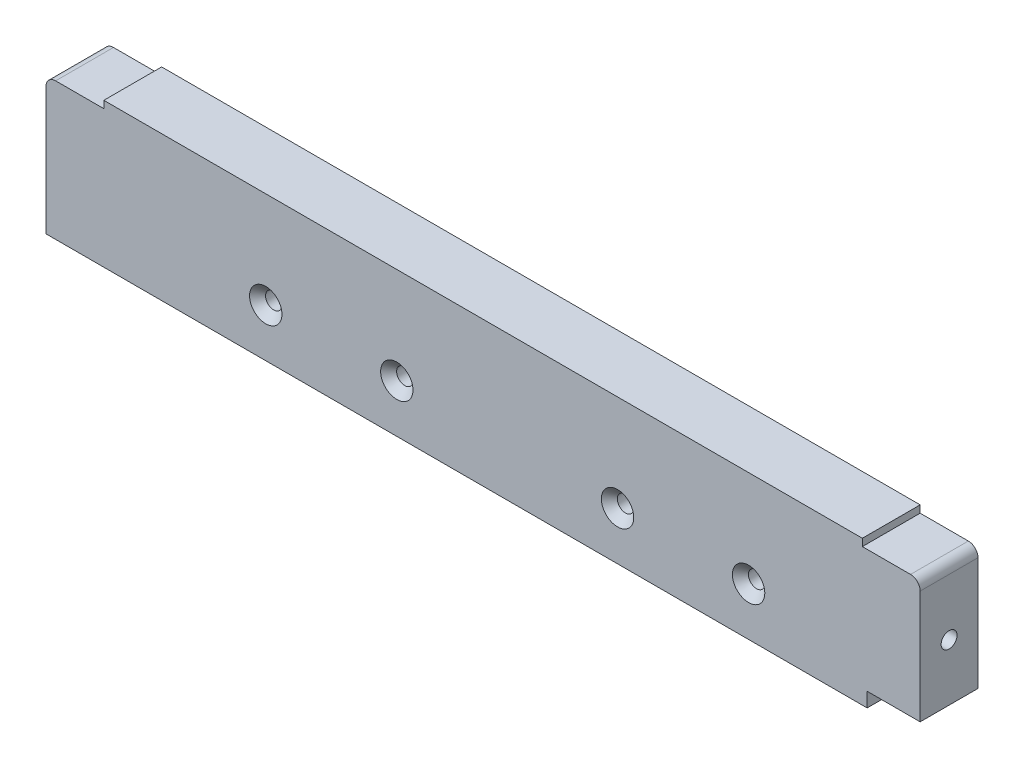
ISO-10303-21;
HEADER;
FILE_DESCRIPTION(('STEP AP214'),'2;1');
FILE_NAME('part.step','',(''),(''),'','','');
FILE_SCHEMA(('AUTOMOTIVE_DESIGN { 1 0 10303 214 1 1 1 1 }'));
ENDSEC;
DATA;
#1=APPLICATION_CONTEXT('core data for automotive mechanical design processes');
#2=APPLICATION_PROTOCOL_DEFINITION('international standard','automotive_design',2000,#1);
#3=PRODUCT_CONTEXT('',#1,'mechanical');
#4=PRODUCT('Part','Part','',(#3));
#5=PRODUCT_RELATED_PRODUCT_CATEGORY('part','',(#4));
#6=PRODUCT_DEFINITION_FORMATION('','',#4);
#7=PRODUCT_DEFINITION_CONTEXT('part definition',#1,'design');
#8=PRODUCT_DEFINITION('design','',#6,#7);
#9=PRODUCT_DEFINITION_SHAPE('','',#8);
#10=(LENGTH_UNIT() NAMED_UNIT(*) SI_UNIT(.MILLI.,.METRE.));
#11=(NAMED_UNIT(*) PLANE_ANGLE_UNIT() SI_UNIT($,.RADIAN.));
#12=(NAMED_UNIT(*) SI_UNIT($,.STERADIAN.) SOLID_ANGLE_UNIT());
#13=UNCERTAINTY_MEASURE_WITH_UNIT(LENGTH_MEASURE(1.E-05),#10,'distance_accuracy_value','');
#14=(GEOMETRIC_REPRESENTATION_CONTEXT(3) GLOBAL_UNCERTAINTY_ASSIGNED_CONTEXT((#13)) GLOBAL_UNIT_ASSIGNED_CONTEXT((#10,
#11,#12)) REPRESENTATION_CONTEXT('',''));
#15=CARTESIAN_POINT('',(0.,0.,0.));
#16=DIRECTION('',(0.,0.,1.));
#17=DIRECTION('',(1.,0.,0.));
#18=AXIS2_PLACEMENT_3D('',#15,#16,#17);
#19=CARTESIAN_POINT('',(71.4596928261496,170.,12.));
#20=DIRECTION('',(-1.,0.,0.));
#21=DIRECTION('',(0.,0.,1.));
#22=AXIS2_PLACEMENT_3D('',#19,#20,#21);
#23=PLANE('',#22);
#24=CARTESIAN_POINT('',(71.4596928261496,184.75,6.));
#25=DIRECTION('',(1.,0.,0.));
#26=DIRECTION('',(0.,0.,-1.));
#27=AXIS2_PLACEMENT_3D('',#24,#25,#26);
#28=CIRCLE('',#27,1.65000000000001);
#29=CARTESIAN_POINT('',(71.4596928261496,184.75,4.34999999999999));
#30=VERTEX_POINT('',#29);
#31=EDGE_CURVE('E152',#30,#30,#28,.T.);
#32=ORIENTED_EDGE('',*,*,#31,.F.);
#33=EDGE_LOOP('',(#32));
#34=FACE_BOUND('',#33,.T.);
#35=DIRECTION('',(0.,0.,1.));
#36=VECTOR('',#35,1.);
#37=CARTESIAN_POINT('',(71.4596928261496,173.,0.));
#38=LINE('',#37,#36);
#39=CARTESIAN_POINT('',(71.4596928261496,173.,0.));
#40=VERTEX_POINT('',#39);
#41=CARTESIAN_POINT('',(71.4596928261496,173.,12.));
#42=VERTEX_POINT('',#41);
#43=EDGE_CURVE('E160',#40,#42,#38,.T.);
#44=ORIENTED_EDGE('',*,*,#43,.F.);
#45=DIRECTION('',(0.,1.,0.));
#46=VECTOR('',#45,1.);
#47=CARTESIAN_POINT('',(71.4596928261496,170.,0.));
#48=LINE('',#47,#46);
#49=CARTESIAN_POINT('',(71.4596928261496,196.5,0.));
#50=VERTEX_POINT('',#49);
#51=EDGE_CURVE('E189',#40,#50,#48,.T.);
#52=ORIENTED_EDGE('',*,*,#51,.T.);
#53=DIRECTION('',(0.,0.,-1.));
#54=VECTOR('',#53,1.);
#55=CARTESIAN_POINT('',(71.4596928261496,196.5,12.));
#56=LINE('',#55,#54);
#57=CARTESIAN_POINT('',(71.4596928261496,196.5,12.));
#58=VERTEX_POINT('',#57);
#59=EDGE_CURVE('E255',#50,#58,#56,.F.);
#60=ORIENTED_EDGE('',*,*,#59,.T.);
#61=DIRECTION('',(0.,1.,0.));
#62=VECTOR('',#61,1.);
#63=CARTESIAN_POINT('',(71.4596928261496,170.,12.));
#64=LINE('',#63,#62);
#65=EDGE_CURVE('E191',#42,#58,#64,.T.);
#66=ORIENTED_EDGE('',*,*,#65,.F.);
#67=EDGE_LOOP('',(#44,#52,#60,#66));
#68=FACE_BOUND('',#67,.T.);
#69=ADVANCED_FACE('F33',(#34,#68),#23,.F.);
#70=CARTESIAN_POINT('',(-73.7403071738504,170.,12.));
#71=DIRECTION('',(0.,1.,0.));
#72=DIRECTION('',(0.,0.,1.));
#73=AXIS2_PLACEMENT_3D('',#70,#71,#72);
#74=PLANE('',#73);
#75=DIRECTION('',(1.,0.,0.));
#76=VECTOR('',#75,1.);
#77=CARTESIAN_POINT('',(-73.7403071738504,170.,0.));
#78=LINE('',#77,#76);
#79=CARTESIAN_POINT('',(-109.94030717385,170.,0.));
#80=VERTEX_POINT('',#79);
#81=CARTESIAN_POINT('',(60.4596928261496,170.,0.));
#82=VERTEX_POINT('',#81);
#83=EDGE_CURVE('E237',#80,#82,#78,.T.);
#84=ORIENTED_EDGE('',*,*,#83,.T.);
#85=DIRECTION('',(0.,0.,-1.));
#86=VECTOR('',#85,1.);
#87=CARTESIAN_POINT('',(60.4596928261496,170.,0.));
#88=LINE('',#87,#86);
#89=CARTESIAN_POINT('',(60.4596928261496,170.,12.));
#90=VERTEX_POINT('',#89);
#91=EDGE_CURVE('E159',#90,#82,#88,.T.);
#92=ORIENTED_EDGE('',*,*,#91,.F.);
#93=DIRECTION('',(1.,0.,0.));
#94=VECTOR('',#93,1.);
#95=CARTESIAN_POINT('',(-73.7403071738504,170.,12.));
#96=LINE('',#95,#94);
#97=CARTESIAN_POINT('',(-109.94030717385,170.,12.));
#98=VERTEX_POINT('',#97);
#99=EDGE_CURVE('E238',#98,#90,#96,.T.);
#100=ORIENTED_EDGE('',*,*,#99,.F.);
#101=DIRECTION('',(0.,0.,-1.));
#102=VECTOR('',#101,1.);
#103=CARTESIAN_POINT('',(-109.94030717385,170.,12.));
#104=LINE('',#103,#102);
#105=EDGE_CURVE('E197',#98,#80,#104,.T.);
#106=ORIENTED_EDGE('',*,*,#105,.T.);
#107=EDGE_LOOP('',(#84,#92,#100,#106));
#108=FACE_BOUND('',#107,.T.);
#109=ADVANCED_FACE('F292',(#108),#74,.F.);
#110=CARTESIAN_POINT('',(-73.7403071738504,200.,12.));
#111=DIRECTION('',(0.,-1.,0.));
#112=DIRECTION('',(0.,0.,-1.));
#113=AXIS2_PLACEMENT_3D('',#110,#111,#112);
#114=PLANE('',#113);
#115=DIRECTION('',(-1.,0.,0.));
#116=VECTOR('',#115,1.);
#117=CARTESIAN_POINT('',(-73.7403071738504,200.,0.));
#118=LINE('',#117,#116);
#119=CARTESIAN_POINT('',(59.4596928261496,200.,0.));
#120=VERTEX_POINT('',#119);
#121=CARTESIAN_POINT('',(-97.9403071738504,200.,0.));
#122=VERTEX_POINT('',#121);
#123=EDGE_CURVE('E242',#120,#122,#118,.T.);
#124=ORIENTED_EDGE('',*,*,#123,.T.);
#125=DIRECTION('',(0.,0.,-1.));
#126=VECTOR('',#125,1.);
#127=CARTESIAN_POINT('',(-97.9403071738504,200.,12.));
#128=LINE('',#127,#126);
#129=CARTESIAN_POINT('',(-97.9403071738504,200.,12.));
#130=VERTEX_POINT('',#129);
#131=EDGE_CURVE('E133',#130,#122,#128,.T.);
#132=ORIENTED_EDGE('',*,*,#131,.F.);
#133=DIRECTION('',(-1.,0.,0.));
#134=VECTOR('',#133,1.);
#135=CARTESIAN_POINT('',(-73.7403071738504,200.,12.));
#136=LINE('',#135,#134);
#137=CARTESIAN_POINT('',(59.4596928261496,200.,12.));
#138=VERTEX_POINT('',#137);
#139=EDGE_CURVE('E241',#138,#130,#136,.T.);
#140=ORIENTED_EDGE('',*,*,#139,.F.);
#141=DIRECTION('',(0.,0.,1.));
#142=VECTOR('',#141,1.);
#143=CARTESIAN_POINT('',(59.4596928261496,200.,12.));
#144=LINE('',#143,#142);
#145=EDGE_CURVE('E174',#120,#138,#144,.T.);
#146=ORIENTED_EDGE('',*,*,#145,.F.);
#147=EDGE_LOOP('',(#124,#132,#140,#146));
#148=FACE_BOUND('',#147,.T.);
#149=ADVANCED_FACE('F278',(#148),#114,.F.);
#150=CARTESIAN_POINT('',(-73.7403071738504,170.,12.));
#151=DIRECTION('',(0.,0.,1.));
#152=DIRECTION('',(1.,0.,0.));
#153=AXIS2_PLACEMENT_3D('',#150,#151,#152);
#154=PLANE('',#153);
#155=DIRECTION('',(1.,0.,0.));
#156=VECTOR('',#155,1.);
#157=CARTESIAN_POINT('',(-109.94030717385,198.5,12.));
#158=LINE('',#157,#156);
#159=CARTESIAN_POINT('',(-107.94030717385,198.5,12.));
#160=VERTEX_POINT('',#159);
#161=CARTESIAN_POINT('',(-97.9403071738504,198.5,12.));
#162=VERTEX_POINT('',#161);
#163=EDGE_CURVE('E136',#160,#162,#158,.T.);
#164=ORIENTED_EDGE('',*,*,#163,.F.);
#165=CARTESIAN_POINT('',(-107.94030717385,196.5,12.));
#166=DIRECTION('',(0.,0.,1.));
#167=DIRECTION('',(1.,0.,0.));
#168=AXIS2_PLACEMENT_3D('',#165,#166,#167);
#169=CIRCLE('',#168,2.);
#170=CARTESIAN_POINT('',(-109.94030717385,196.5,12.));
#171=VERTEX_POINT('',#170);
#172=EDGE_CURVE('E55',#160,#171,#169,.T.);
#173=ORIENTED_EDGE('',*,*,#172,.T.);
#174=DIRECTION('',(0.,-1.,0.));
#175=VECTOR('',#174,1.);
#176=CARTESIAN_POINT('',(-109.94030717385,200.,12.));
#177=LINE('',#176,#175);
#178=EDGE_CURVE('E195',#171,#98,#177,.T.);
#179=ORIENTED_EDGE('',*,*,#178,.T.);
#180=ORIENTED_EDGE('',*,*,#99,.T.);
#181=DIRECTION('',(0.,-1.,0.));
#182=VECTOR('',#181,1.);
#183=CARTESIAN_POINT('',(60.4596928261496,173.,12.));
#184=LINE('',#183,#182);
#185=CARTESIAN_POINT('',(60.4596928261496,173.,12.));
#186=VERTEX_POINT('',#185);
#187=EDGE_CURVE('E169',#186,#90,#184,.T.);
#188=ORIENTED_EDGE('',*,*,#187,.F.);
#189=DIRECTION('',(-1.,0.,0.));
#190=VECTOR('',#189,1.);
#191=CARTESIAN_POINT('',(71.4596928261496,173.,12.));
#192=LINE('',#191,#190);
#193=EDGE_CURVE('E162',#42,#186,#192,.T.);
#194=ORIENTED_EDGE('',*,*,#193,.F.);
#195=ORIENTED_EDGE('',*,*,#65,.T.);
#196=CARTESIAN_POINT('',(69.4596928261496,196.5,12.));
#197=DIRECTION('',(0.,0.,1.));
#198=DIRECTION('',(1.,0.,0.));
#199=AXIS2_PLACEMENT_3D('',#196,#197,#198);
#200=CIRCLE('',#199,2.);
#201=CARTESIAN_POINT('',(69.4596928261496,198.5,12.));
#202=VERTEX_POINT('',#201);
#203=EDGE_CURVE('E258',#58,#202,#200,.T.);
#204=ORIENTED_EDGE('',*,*,#203,.T.);
#205=DIRECTION('',(1.,0.,0.));
#206=VECTOR('',#205,1.);
#207=CARTESIAN_POINT('',(71.4596928261496,198.5,12.));
#208=LINE('',#207,#206);
#209=CARTESIAN_POINT('',(59.4596928261496,198.5,12.));
#210=VERTEX_POINT('',#209);
#211=EDGE_CURVE('E181',#210,#202,#208,.T.);
#212=ORIENTED_EDGE('',*,*,#211,.F.);
#213=DIRECTION('',(0.,1.,0.));
#214=VECTOR('',#213,1.);
#215=CARTESIAN_POINT('',(59.4596928261496,198.5,12.));
#216=LINE('',#215,#214);
#217=EDGE_CURVE('E186',#210,#138,#216,.T.);
#218=ORIENTED_EDGE('',*,*,#217,.T.);
#219=ORIENTED_EDGE('',*,*,#139,.T.);
#220=DIRECTION('',(0.,1.,0.));
#221=VECTOR('',#220,1.);
#222=CARTESIAN_POINT('',(-97.9403071738504,198.5,12.));
#223=LINE('',#222,#221);
#224=EDGE_CURVE('E147',#162,#130,#223,.T.);
#225=ORIENTED_EDGE('',*,*,#224,.F.);
#226=EDGE_LOOP('',(#164,#173,#179,#180,#188,#194,#195,#204,#212,#218,#219,#225));
#227=FACE_BOUND('',#226,.T.);
#228=CARTESIAN_POINT('',(35.8596928261496,180.,12.));
#229=DIRECTION('',(0.,0.,1.));
#230=DIRECTION('',(1.,0.,0.));
#231=AXIS2_PLACEMENT_3D('',#228,#229,#230);
#232=CIRCLE('',#231,3.36);
#233=CARTESIAN_POINT('',(39.2196928261496,180.,12.));
#234=VERTEX_POINT('',#233);
#235=EDGE_CURVE('E201',#234,#234,#232,.T.);
#236=ORIENTED_EDGE('',*,*,#235,.F.);
#237=EDGE_LOOP('',(#236));
#238=FACE_BOUND('',#237,.T.);
#239=CARTESIAN_POINT('',(-64.3403071738504,180.,12.));
#240=DIRECTION('',(0.,0.,1.));
#241=DIRECTION('',(1.,0.,0.));
#242=AXIS2_PLACEMENT_3D('',#239,#240,#241);
#243=CIRCLE('',#242,3.36);
#244=CARTESIAN_POINT('',(-60.9803071738504,180.,12.));
#245=VERTEX_POINT('',#244);
#246=EDGE_CURVE('E210',#245,#245,#243,.T.);
#247=ORIENTED_EDGE('',*,*,#246,.F.);
#248=EDGE_LOOP('',(#247));
#249=FACE_BOUND('',#248,.T.);
#250=CARTESIAN_POINT('',(-37.1403071738504,180.,12.));
#251=DIRECTION('',(0.,0.,1.));
#252=DIRECTION('',(1.,0.,0.));
#253=AXIS2_PLACEMENT_3D('',#250,#251,#252);
#254=CIRCLE('',#253,3.36);
#255=CARTESIAN_POINT('',(-33.7803071738504,180.,12.));
#256=VERTEX_POINT('',#255);
#257=EDGE_CURVE('E219',#256,#256,#254,.T.);
#258=ORIENTED_EDGE('',*,*,#257,.F.);
#259=EDGE_LOOP('',(#258));
#260=FACE_BOUND('',#259,.T.);
#261=CARTESIAN_POINT('',(8.65969282614964,180.,12.));
#262=DIRECTION('',(0.,0.,1.));
#263=DIRECTION('',(1.,0.,0.));
#264=AXIS2_PLACEMENT_3D('',#261,#262,#263);
#265=CIRCLE('',#264,3.36);
#266=CARTESIAN_POINT('',(12.0196928261496,180.,12.));
#267=VERTEX_POINT('',#266);
#268=EDGE_CURVE('E228',#267,#267,#265,.T.);
#269=ORIENTED_EDGE('',*,*,#268,.F.);
#270=EDGE_LOOP('',(#269));
#271=FACE_BOUND('',#270,.T.);
#272=ADVANCED_FACE('F271',(#227,#238,#249,#260,#271),#154,.T.);
#273=CARTESIAN_POINT('',(-73.7403071738504,170.,0.));
#274=DIRECTION('',(0.,0.,1.));
#275=DIRECTION('',(1.,0.,0.));
#276=AXIS2_PLACEMENT_3D('',#273,#274,#275);
#277=PLANE('',#276);
#278=CARTESIAN_POINT('',(35.8596928261496,180.,0.));
#279=DIRECTION('',(0.,0.,1.));
#280=DIRECTION('',(1.,0.,0.));
#281=AXIS2_PLACEMENT_3D('',#278,#279,#280);
#282=CIRCLE('',#281,1.69999999999999);
#283=CARTESIAN_POINT('',(37.5596928261496,180.,0.));
#284=VERTEX_POINT('',#283);
#285=EDGE_CURVE('E207',#284,#284,#282,.T.);
#286=ORIENTED_EDGE('',*,*,#285,.T.);
#287=EDGE_LOOP('',(#286));
#288=FACE_BOUND('',#287,.T.);
#289=CARTESIAN_POINT('',(-64.3403071738504,180.,0.));
#290=DIRECTION('',(0.,0.,1.));
#291=DIRECTION('',(1.,0.,0.));
#292=AXIS2_PLACEMENT_3D('',#289,#290,#291);
#293=CIRCLE('',#292,1.69999999999999);
#294=CARTESIAN_POINT('',(-62.6403071738504,180.,0.));
#295=VERTEX_POINT('',#294);
#296=EDGE_CURVE('E216',#295,#295,#293,.T.);
#297=ORIENTED_EDGE('',*,*,#296,.T.);
#298=EDGE_LOOP('',(#297));
#299=FACE_BOUND('',#298,.T.);
#300=CARTESIAN_POINT('',(-37.1403071738504,180.,0.));
#301=DIRECTION('',(0.,0.,1.));
#302=DIRECTION('',(1.,0.,0.));
#303=AXIS2_PLACEMENT_3D('',#300,#301,#302);
#304=CIRCLE('',#303,1.69999999999999);
#305=CARTESIAN_POINT('',(-35.4403071738504,180.,0.));
#306=VERTEX_POINT('',#305);
#307=EDGE_CURVE('E225',#306,#306,#304,.T.);
#308=ORIENTED_EDGE('',*,*,#307,.T.);
#309=EDGE_LOOP('',(#308));
#310=FACE_BOUND('',#309,.T.);
#311=CARTESIAN_POINT('',(8.65969282614964,180.,0.));
#312=DIRECTION('',(0.,0.,1.));
#313=DIRECTION('',(1.,0.,0.));
#314=AXIS2_PLACEMENT_3D('',#311,#312,#313);
#315=CIRCLE('',#314,1.69999999999999);
#316=CARTESIAN_POINT('',(10.3596928261496,180.,0.));
#317=VERTEX_POINT('',#316);
#318=EDGE_CURVE('E234',#317,#317,#315,.T.);
#319=ORIENTED_EDGE('',*,*,#318,.T.);
#320=EDGE_LOOP('',(#319));
#321=FACE_BOUND('',#320,.T.);
#322=DIRECTION('',(0.,-1.,0.));
#323=VECTOR('',#322,1.);
#324=CARTESIAN_POINT('',(-109.94030717385,200.,0.));
#325=LINE('',#324,#323);
#326=CARTESIAN_POINT('',(-109.94030717385,196.5,0.));
#327=VERTEX_POINT('',#326);
#328=EDGE_CURVE('E193',#327,#80,#325,.T.);
#329=ORIENTED_EDGE('',*,*,#328,.F.);
#330=CARTESIAN_POINT('',(-107.94030717385,196.5,0.));
#331=DIRECTION('',(0.,0.,1.));
#332=DIRECTION('',(1.,0.,0.));
#333=AXIS2_PLACEMENT_3D('',#330,#331,#332);
#334=CIRCLE('',#333,2.);
#335=CARTESIAN_POINT('',(-107.94030717385,198.5,0.));
#336=VERTEX_POINT('',#335);
#337=EDGE_CURVE('E11',#327,#336,#334,.F.);
#338=ORIENTED_EDGE('',*,*,#337,.T.);
#339=DIRECTION('',(-1.,0.,0.));
#340=VECTOR('',#339,1.);
#341=CARTESIAN_POINT('',(-109.94030717385,198.5,0.));
#342=LINE('',#341,#340);
#343=CARTESIAN_POINT('',(-97.9403071738504,198.5,0.));
#344=VERTEX_POINT('',#343);
#345=EDGE_CURVE('E145',#344,#336,#342,.T.);
#346=ORIENTED_EDGE('',*,*,#345,.F.);
#347=DIRECTION('',(0.,1.,0.));
#348=VECTOR('',#347,1.);
#349=CARTESIAN_POINT('',(-97.9403071738504,198.5,0.));
#350=LINE('',#349,#348);
#351=EDGE_CURVE('E149',#344,#122,#350,.T.);
#352=ORIENTED_EDGE('',*,*,#351,.T.);
#353=ORIENTED_EDGE('',*,*,#123,.F.);
#354=DIRECTION('',(0.,1.,0.));
#355=VECTOR('',#354,1.);
#356=CARTESIAN_POINT('',(59.4596928261496,198.5,0.));
#357=LINE('',#356,#355);
#358=CARTESIAN_POINT('',(59.4596928261496,198.5,0.));
#359=VERTEX_POINT('',#358);
#360=EDGE_CURVE('E184',#359,#120,#357,.T.);
#361=ORIENTED_EDGE('',*,*,#360,.F.);
#362=DIRECTION('',(-1.,0.,0.));
#363=VECTOR('',#362,1.);
#364=CARTESIAN_POINT('',(71.4596928261496,198.5,0.));
#365=LINE('',#364,#363);
#366=CARTESIAN_POINT('',(69.4596928261496,198.5,0.));
#367=VERTEX_POINT('',#366);
#368=EDGE_CURVE('E176',#367,#359,#365,.T.);
#369=ORIENTED_EDGE('',*,*,#368,.F.);
#370=CARTESIAN_POINT('',(69.4596928261496,196.5,0.));
#371=DIRECTION('',(0.,0.,1.));
#372=DIRECTION('',(1.,0.,0.));
#373=AXIS2_PLACEMENT_3D('',#370,#371,#372);
#374=CIRCLE('',#373,2.);
#375=EDGE_CURVE('E252',#367,#50,#374,.F.);
#376=ORIENTED_EDGE('',*,*,#375,.T.);
#377=ORIENTED_EDGE('',*,*,#51,.F.);
#378=DIRECTION('',(1.,0.,0.));
#379=VECTOR('',#378,1.);
#380=CARTESIAN_POINT('',(71.4596928261496,173.,0.));
#381=LINE('',#380,#379);
#382=CARTESIAN_POINT('',(60.4596928261496,173.,0.));
#383=VERTEX_POINT('',#382);
#384=EDGE_CURVE('E167',#383,#40,#381,.T.);
#385=ORIENTED_EDGE('',*,*,#384,.F.);
#386=DIRECTION('',(0.,-1.,0.));
#387=VECTOR('',#386,1.);
#388=CARTESIAN_POINT('',(60.4596928261496,173.,0.));
#389=LINE('',#388,#387);
#390=EDGE_CURVE('E171',#383,#82,#389,.T.);
#391=ORIENTED_EDGE('',*,*,#390,.T.);
#392=ORIENTED_EDGE('',*,*,#83,.F.);
#393=EDGE_LOOP('',(#329,#338,#346,#352,#353,#361,#369,#376,#377,#385,#391,#392));
#394=FACE_BOUND('',#393,.T.);
#395=ADVANCED_FACE('F283',(#288,#299,#310,#321,#394),#277,.F.);
#396=CARTESIAN_POINT('',(8.65969282614964,180.,12.));
#397=DIRECTION('',(0.,0.,1.));
#398=DIRECTION('',(1.,0.,0.));
#399=AXIS2_PLACEMENT_3D('',#396,#397,#398);
#400=CYLINDRICAL_SURFACE('',#399,1.7);
#401=ORIENTED_EDGE('',*,*,#318,.F.);
#402=EDGE_LOOP('',(#401));
#403=FACE_BOUND('',#402,.T.);
#404=CARTESIAN_POINT('',(8.65969282614964,180.,10.34));
#405=DIRECTION('',(0.,0.,1.));
#406=DIRECTION('',(1.,0.,0.));
#407=AXIS2_PLACEMENT_3D('',#404,#405,#406);
#408=CIRCLE('',#407,1.7);
#409=CARTESIAN_POINT('',(10.3596928261496,180.,10.34));
#410=VERTEX_POINT('',#409);
#411=EDGE_CURVE('E231',#410,#410,#408,.T.);
#412=ORIENTED_EDGE('',*,*,#411,.T.);
#413=EDGE_LOOP('',(#412));
#414=FACE_BOUND('',#413,.T.);
#415=ADVANCED_FACE('F337',(#403,#414),#400,.F.);
#416=CARTESIAN_POINT('',(8.65969282614964,180.,12.));
#417=DIRECTION('',(0.,0.,1.));
#418=DIRECTION('',(1.,0.,0.));
#419=AXIS2_PLACEMENT_3D('',#416,#417,#418);
#420=CONICAL_SURFACE('',#419,3.36,0.785398163397449);
#421=ORIENTED_EDGE('',*,*,#411,.F.);
#422=EDGE_LOOP('',(#421));
#423=FACE_BOUND('',#422,.T.);
#424=ORIENTED_EDGE('',*,*,#268,.T.);
#425=EDGE_LOOP('',(#424));
#426=FACE_BOUND('',#425,.T.);
#427=ADVANCED_FACE('F333',(#423,#426),#420,.F.);
#428=CARTESIAN_POINT('',(-37.1403071738504,180.,12.));
#429=DIRECTION('',(0.,0.,1.));
#430=DIRECTION('',(1.,0.,0.));
#431=AXIS2_PLACEMENT_3D('',#428,#429,#430);
#432=CYLINDRICAL_SURFACE('',#431,1.7);
#433=ORIENTED_EDGE('',*,*,#307,.F.);
#434=EDGE_LOOP('',(#433));
#435=FACE_BOUND('',#434,.T.);
#436=CARTESIAN_POINT('',(-37.1403071738504,180.,10.34));
#437=DIRECTION('',(0.,0.,1.));
#438=DIRECTION('',(1.,0.,0.));
#439=AXIS2_PLACEMENT_3D('',#436,#437,#438);
#440=CIRCLE('',#439,1.7);
#441=CARTESIAN_POINT('',(-35.4403071738504,180.,10.34));
#442=VERTEX_POINT('',#441);
#443=EDGE_CURVE('E222',#442,#442,#440,.T.);
#444=ORIENTED_EDGE('',*,*,#443,.T.);
#445=EDGE_LOOP('',(#444));
#446=FACE_BOUND('',#445,.T.);
#447=ADVANCED_FACE('F329',(#435,#446),#432,.F.);
#448=CARTESIAN_POINT('',(-37.1403071738504,180.,12.));
#449=DIRECTION('',(0.,0.,1.));
#450=DIRECTION('',(1.,0.,0.));
#451=AXIS2_PLACEMENT_3D('',#448,#449,#450);
#452=CONICAL_SURFACE('',#451,3.36,0.785398163397449);
#453=ORIENTED_EDGE('',*,*,#443,.F.);
#454=EDGE_LOOP('',(#453));
#455=FACE_BOUND('',#454,.T.);
#456=ORIENTED_EDGE('',*,*,#257,.T.);
#457=EDGE_LOOP('',(#456));
#458=FACE_BOUND('',#457,.T.);
#459=ADVANCED_FACE('F325',(#455,#458),#452,.F.);
#460=CARTESIAN_POINT('',(-64.3403071738504,180.,12.));
#461=DIRECTION('',(0.,0.,1.));
#462=DIRECTION('',(1.,0.,0.));
#463=AXIS2_PLACEMENT_3D('',#460,#461,#462);
#464=CYLINDRICAL_SURFACE('',#463,1.69999999999999);
#465=ORIENTED_EDGE('',*,*,#296,.F.);
#466=EDGE_LOOP('',(#465));
#467=FACE_BOUND('',#466,.T.);
#468=CARTESIAN_POINT('',(-64.3403071738504,180.,10.34));
#469=DIRECTION('',(0.,0.,1.));
#470=DIRECTION('',(1.,0.,0.));
#471=AXIS2_PLACEMENT_3D('',#468,#469,#470);
#472=CIRCLE('',#471,1.69999999999999);
#473=CARTESIAN_POINT('',(-62.6403071738504,180.,10.34));
#474=VERTEX_POINT('',#473);
#475=EDGE_CURVE('E213',#474,#474,#472,.T.);
#476=ORIENTED_EDGE('',*,*,#475,.T.);
#477=EDGE_LOOP('',(#476));
#478=FACE_BOUND('',#477,.T.);
#479=ADVANCED_FACE('F321',(#467,#478),#464,.F.);
#480=CARTESIAN_POINT('',(-64.3403071738504,180.,12.));
#481=DIRECTION('',(0.,0.,1.));
#482=DIRECTION('',(1.,0.,0.));
#483=AXIS2_PLACEMENT_3D('',#480,#481,#482);
#484=CONICAL_SURFACE('',#483,3.36,0.785398163397451);
#485=ORIENTED_EDGE('',*,*,#475,.F.);
#486=EDGE_LOOP('',(#485));
#487=FACE_BOUND('',#486,.T.);
#488=ORIENTED_EDGE('',*,*,#246,.T.);
#489=EDGE_LOOP('',(#488));
#490=FACE_BOUND('',#489,.T.);
#491=ADVANCED_FACE('F317',(#487,#490),#484,.F.);
#492=CARTESIAN_POINT('',(35.8596928261496,180.,12.));
#493=DIRECTION('',(0.,0.,1.));
#494=DIRECTION('',(1.,0.,0.));
#495=AXIS2_PLACEMENT_3D('',#492,#493,#494);
#496=CYLINDRICAL_SURFACE('',#495,1.7);
#497=ORIENTED_EDGE('',*,*,#285,.F.);
#498=EDGE_LOOP('',(#497));
#499=FACE_BOUND('',#498,.T.);
#500=CARTESIAN_POINT('',(35.8596928261496,180.,10.34));
#501=DIRECTION('',(0.,0.,1.));
#502=DIRECTION('',(1.,0.,0.));
#503=AXIS2_PLACEMENT_3D('',#500,#501,#502);
#504=CIRCLE('',#503,1.7);
#505=CARTESIAN_POINT('',(37.5596928261497,180.,10.34));
#506=VERTEX_POINT('',#505);
#507=EDGE_CURVE('E204',#506,#506,#504,.T.);
#508=ORIENTED_EDGE('',*,*,#507,.T.);
#509=EDGE_LOOP('',(#508));
#510=FACE_BOUND('',#509,.T.);
#511=ADVANCED_FACE('F313',(#499,#510),#496,.F.);
#512=CARTESIAN_POINT('',(35.8596928261496,180.,12.));
#513=DIRECTION('',(0.,0.,1.));
#514=DIRECTION('',(1.,0.,0.));
#515=AXIS2_PLACEMENT_3D('',#512,#513,#514);
#516=CONICAL_SURFACE('',#515,3.36,0.785398163397449);
#517=ORIENTED_EDGE('',*,*,#507,.F.);
#518=EDGE_LOOP('',(#517));
#519=FACE_BOUND('',#518,.T.);
#520=ORIENTED_EDGE('',*,*,#235,.T.);
#521=EDGE_LOOP('',(#520));
#522=FACE_BOUND('',#521,.T.);
#523=ADVANCED_FACE('F309',(#519,#522),#516,.F.);
#524=CARTESIAN_POINT('',(-109.94030717385,200.,12.));
#525=DIRECTION('',(1.,0.,0.));
#526=DIRECTION('',(0.,0.,-1.));
#527=AXIS2_PLACEMENT_3D('',#524,#525,#526);
#528=PLANE('',#527);
#529=CARTESIAN_POINT('',(-109.94030717385,184.558440573065,5.50000000000001));
#530=DIRECTION('',(-1.,0.,0.));
#531=DIRECTION('',(0.,0.,1.));
#532=AXIS2_PLACEMENT_3D('',#529,#530,#531);
#533=CIRCLE('',#532,1.64999999999998);
#534=CARTESIAN_POINT('',(-109.94030717385,184.558440573065,7.14999999999999));
#535=VERTEX_POINT('',#534);
#536=EDGE_CURVE('E134',#535,#535,#533,.T.);
#537=ORIENTED_EDGE('',*,*,#536,.F.);
#538=EDGE_LOOP('',(#537));
#539=FACE_BOUND('',#538,.T.);
#540=ORIENTED_EDGE('',*,*,#178,.F.);
#541=DIRECTION('',(0.,0.,1.));
#542=VECTOR('',#541,1.);
#543=CARTESIAN_POINT('',(-109.94030717385,196.5,12.));
#544=LINE('',#543,#542);
#545=EDGE_CURVE('E41',#171,#327,#544,.F.);
#546=ORIENTED_EDGE('',*,*,#545,.T.);
#547=ORIENTED_EDGE('',*,*,#328,.T.);
#548=ORIENTED_EDGE('',*,*,#105,.F.);
#549=EDGE_LOOP('',(#540,#546,#547,#548));
#550=FACE_BOUND('',#549,.T.);
#551=ADVANCED_FACE('F306',(#539,#550),#528,.F.);
#552=CARTESIAN_POINT('',(59.4596928261496,198.5,12.));
#553=DIRECTION('',(-1.,0.,0.));
#554=DIRECTION('',(0.,0.,1.));
#555=AXIS2_PLACEMENT_3D('',#552,#553,#554);
#556=PLANE('',#555);
#557=ORIENTED_EDGE('',*,*,#145,.T.);
#558=ORIENTED_EDGE('',*,*,#217,.F.);
#559=DIRECTION('',(0.,0.,1.));
#560=VECTOR('',#559,1.);
#561=CARTESIAN_POINT('',(59.4596928261496,198.5,12.));
#562=LINE('',#561,#560);
#563=EDGE_CURVE('E178',#359,#210,#562,.T.);
#564=ORIENTED_EDGE('',*,*,#563,.F.);
#565=ORIENTED_EDGE('',*,*,#360,.T.);
#566=EDGE_LOOP('',(#557,#558,#564,#565));
#567=FACE_BOUND('',#566,.T.);
#568=ADVANCED_FACE('F304',(#567),#556,.F.);
#569=CARTESIAN_POINT('',(71.4596928261496,198.5,0.));
#570=DIRECTION('',(0.,1.,0.));
#571=DIRECTION('',(0.,0.,1.));
#572=AXIS2_PLACEMENT_3D('',#569,#570,#571);
#573=PLANE('',#572);
#574=ORIENTED_EDGE('',*,*,#211,.T.);
#575=DIRECTION('',(0.,0.,-1.));
#576=VECTOR('',#575,1.);
#577=CARTESIAN_POINT('',(69.4596928261496,198.5,0.));
#578=LINE('',#577,#576);
#579=EDGE_CURVE('E245',#202,#367,#578,.T.);
#580=ORIENTED_EDGE('',*,*,#579,.T.);
#581=ORIENTED_EDGE('',*,*,#368,.T.);
#582=ORIENTED_EDGE('',*,*,#563,.T.);
#583=EDGE_LOOP('',(#574,#580,#581,#582));
#584=FACE_BOUND('',#583,.T.);
#585=ADVANCED_FACE('F351',(#584),#573,.T.);
#586=CARTESIAN_POINT('',(69.4596928261496,196.5,0.));
#587=DIRECTION('',(0.,0.,1.));
#588=DIRECTION('',(1.,0.,0.));
#589=AXIS2_PLACEMENT_3D('',#586,#587,#588);
#590=CYLINDRICAL_SURFACE('',#589,2.);
#591=ORIENTED_EDGE('',*,*,#203,.F.);
#592=ORIENTED_EDGE('',*,*,#59,.F.);
#593=ORIENTED_EDGE('',*,*,#375,.F.);
#594=ORIENTED_EDGE('',*,*,#579,.F.);
#595=EDGE_LOOP('',(#591,#592,#593,#594));
#596=FACE_BOUND('',#595,.T.);
#597=ADVANCED_FACE('F348',(#596),#590,.T.);
#598=CARTESIAN_POINT('',(60.4596928261496,173.,0.));
#599=DIRECTION('',(-1.,0.,0.));
#600=DIRECTION('',(0.,0.,1.));
#601=AXIS2_PLACEMENT_3D('',#598,#599,#600);
#602=PLANE('',#601);
#603=ORIENTED_EDGE('',*,*,#91,.T.);
#604=ORIENTED_EDGE('',*,*,#390,.F.);
#605=DIRECTION('',(0.,0.,-1.));
#606=VECTOR('',#605,1.);
#607=CARTESIAN_POINT('',(60.4596928261496,173.,0.));
#608=LINE('',#607,#606);
#609=EDGE_CURVE('E165',#186,#383,#608,.T.);
#610=ORIENTED_EDGE('',*,*,#609,.F.);
#611=ORIENTED_EDGE('',*,*,#187,.T.);
#612=EDGE_LOOP('',(#603,#604,#610,#611));
#613=FACE_BOUND('',#612,.T.);
#614=ADVANCED_FACE('F350',(#613),#602,.F.);
#615=CARTESIAN_POINT('',(71.4596928261496,173.,12.));
#616=DIRECTION('',(0.,-1.,0.));
#617=DIRECTION('',(0.,0.,-1.));
#618=AXIS2_PLACEMENT_3D('',#615,#616,#617);
#619=PLANE('',#618);
#620=ORIENTED_EDGE('',*,*,#43,.T.);
#621=ORIENTED_EDGE('',*,*,#193,.T.);
#622=ORIENTED_EDGE('',*,*,#609,.T.);
#623=ORIENTED_EDGE('',*,*,#384,.T.);
#624=EDGE_LOOP('',(#620,#621,#622,#623));
#625=FACE_BOUND('',#624,.T.);
#626=ADVANCED_FACE('F357',(#625),#619,.T.);
#627=CARTESIAN_POINT('',(61.4596928261496,184.75,6.));
#628=DIRECTION('',(1.,0.,0.));
#629=DIRECTION('',(0.,0.,-1.));
#630=AXIS2_PLACEMENT_3D('',#627,#628,#629);
#631=CONICAL_SURFACE('',#630,1.64999999999998,1.02974425867665);
#632=CARTESIAN_POINT('',(60.4682728047542,184.75,6.));
#633=VERTEX_POINT('',#632);
#634=VERTEX_LOOP('',#633);
#635=FACE_BOUND('',#634,.T.);
#636=CARTESIAN_POINT('',(61.4596928261496,184.75,6.));
#637=DIRECTION('',(1.,0.,0.));
#638=DIRECTION('',(0.,0.,-1.));
#639=AXIS2_PLACEMENT_3D('',#636,#637,#638);
#640=CIRCLE('',#639,1.64999999999998);
#641=CARTESIAN_POINT('',(61.4596928261496,184.75,4.35000000000002));
#642=VERTEX_POINT('',#641);
#643=EDGE_CURVE('E156',#642,#642,#640,.T.);
#644=ORIENTED_EDGE('',*,*,#643,.T.);
#645=EDGE_LOOP('',(#644));
#646=FACE_BOUND('',#645,.T.);
#647=ADVANCED_FACE('F407',(#635,#646),#631,.F.);
#648=CARTESIAN_POINT('',(71.4596928261496,184.75,6.));
#649=DIRECTION('',(1.,0.,0.));
#650=DIRECTION('',(0.,0.,-1.));
#651=AXIS2_PLACEMENT_3D('',#648,#649,#650);
#652=CYLINDRICAL_SURFACE('',#651,1.65);
#653=ORIENTED_EDGE('',*,*,#643,.F.);
#654=EDGE_LOOP('',(#653));
#655=FACE_BOUND('',#654,.T.);
#656=ORIENTED_EDGE('',*,*,#31,.T.);
#657=EDGE_LOOP('',(#656));
#658=FACE_BOUND('',#657,.T.);
#659=ADVANCED_FACE('F421',(#655,#658),#652,.F.);
#660=CARTESIAN_POINT('',(-97.9403071738504,198.5,12.));
#661=DIRECTION('',(1.,0.,0.));
#662=DIRECTION('',(0.,0.,-1.));
#663=AXIS2_PLACEMENT_3D('',#660,#661,#662);
#664=PLANE('',#663);
#665=ORIENTED_EDGE('',*,*,#131,.T.);
#666=ORIENTED_EDGE('',*,*,#351,.F.);
#667=DIRECTION('',(0.,0.,-1.));
#668=VECTOR('',#667,1.);
#669=CARTESIAN_POINT('',(-97.9403071738504,198.5,12.));
#670=LINE('',#669,#668);
#671=EDGE_CURVE('E142',#162,#344,#670,.T.);
#672=ORIENTED_EDGE('',*,*,#671,.F.);
#673=ORIENTED_EDGE('',*,*,#224,.T.);
#674=EDGE_LOOP('',(#665,#666,#672,#673));
#675=FACE_BOUND('',#674,.T.);
#676=ADVANCED_FACE('F276',(#675),#664,.F.);
#677=CARTESIAN_POINT('',(-109.94030717385,198.5,0.));
#678=DIRECTION('',(0.,-1.,0.));
#679=DIRECTION('',(0.,0.,-1.));
#680=AXIS2_PLACEMENT_3D('',#677,#678,#679);
#681=PLANE('',#680);
#682=ORIENTED_EDGE('',*,*,#345,.T.);
#683=DIRECTION('',(0.,0.,1.));
#684=VECTOR('',#683,1.);
#685=CARTESIAN_POINT('',(-107.94030717385,198.5,0.));
#686=LINE('',#685,#684);
#687=EDGE_CURVE('E260',#336,#160,#686,.T.);
#688=ORIENTED_EDGE('',*,*,#687,.T.);
#689=ORIENTED_EDGE('',*,*,#163,.T.);
#690=ORIENTED_EDGE('',*,*,#671,.T.);
#691=EDGE_LOOP('',(#682,#688,#689,#690));
#692=FACE_BOUND('',#691,.T.);
#693=ADVANCED_FACE('F265',(#692),#681,.F.);
#694=CARTESIAN_POINT('',(-107.94030717385,196.5,0.));
#695=DIRECTION('',(0.,0.,1.));
#696=DIRECTION('',(1.,0.,0.));
#697=AXIS2_PLACEMENT_3D('',#694,#695,#696);
#698=CYLINDRICAL_SURFACE('',#697,2.);
#699=ORIENTED_EDGE('',*,*,#337,.F.);
#700=ORIENTED_EDGE('',*,*,#545,.F.);
#701=ORIENTED_EDGE('',*,*,#172,.F.);
#702=ORIENTED_EDGE('',*,*,#687,.F.);
#703=EDGE_LOOP('',(#699,#700,#701,#702));
#704=FACE_BOUND('',#703,.T.);
#705=ADVANCED_FACE('F35',(#704),#698,.T.);
#706=CARTESIAN_POINT('',(-99.9403071738504,184.558440573065,5.50000000000001));
#707=DIRECTION('',(-1.,0.,0.));
#708=DIRECTION('',(0.,0.,1.));
#709=AXIS2_PLACEMENT_3D('',#706,#707,#708);
#710=CONICAL_SURFACE('',#709,1.64999999999998,1.02974425867665);
#711=CARTESIAN_POINT('',(-98.9488871524549,184.558440573065,5.50000000000001));
#712=VERTEX_POINT('',#711);
#713=VERTEX_LOOP('',#712);
#714=FACE_BOUND('',#713,.T.);
#715=CARTESIAN_POINT('',(-99.9403071738504,184.558440573065,5.50000000000001));
#716=DIRECTION('',(-1.,0.,0.));
#717=DIRECTION('',(0.,0.,1.));
#718=AXIS2_PLACEMENT_3D('',#715,#716,#717);
#719=CIRCLE('',#718,1.64999999999998);
#720=CARTESIAN_POINT('',(-99.9403071738504,184.558440573065,7.14999999999999));
#721=VERTEX_POINT('',#720);
#722=EDGE_CURVE('E131',#721,#721,#719,.T.);
#723=ORIENTED_EDGE('',*,*,#722,.T.);
#724=EDGE_LOOP('',(#723));
#725=FACE_BOUND('',#724,.T.);
#726=ADVANCED_FACE('F124',(#714,#725),#710,.F.);
#727=CARTESIAN_POINT('',(-109.94030717385,184.558440573065,5.50000000000001));
#728=DIRECTION('',(-1.,0.,0.));
#729=DIRECTION('',(0.,0.,1.));
#730=AXIS2_PLACEMENT_3D('',#727,#728,#729);
#731=CYLINDRICAL_SURFACE('',#730,1.64999999999998);
#732=ORIENTED_EDGE('',*,*,#722,.F.);
#733=EDGE_LOOP('',(#732));
#734=FACE_BOUND('',#733,.T.);
#735=ORIENTED_EDGE('',*,*,#536,.T.);
#736=EDGE_LOOP('',(#735));
#737=FACE_BOUND('',#736,.T.);
#738=ADVANCED_FACE('F127',(#734,#737),#731,.F.);
#739=CLOSED_SHELL('',(#69,#109,#149,#272,#395,#415,#427,#447,#459,#479,#491,#511,#523,#551,#568,
#585,#597,#614,#626,#647,#659,#676,#693,#705,#726,#738));
#740=MANIFOLD_SOLID_BREP('B2',#739);
#741=ADVANCED_BREP_SHAPE_REPRESENTATION('',(#18,#740),#14);
#742=SHAPE_DEFINITION_REPRESENTATION(#9,#741);
ENDSEC;
END-ISO-10303-21;
